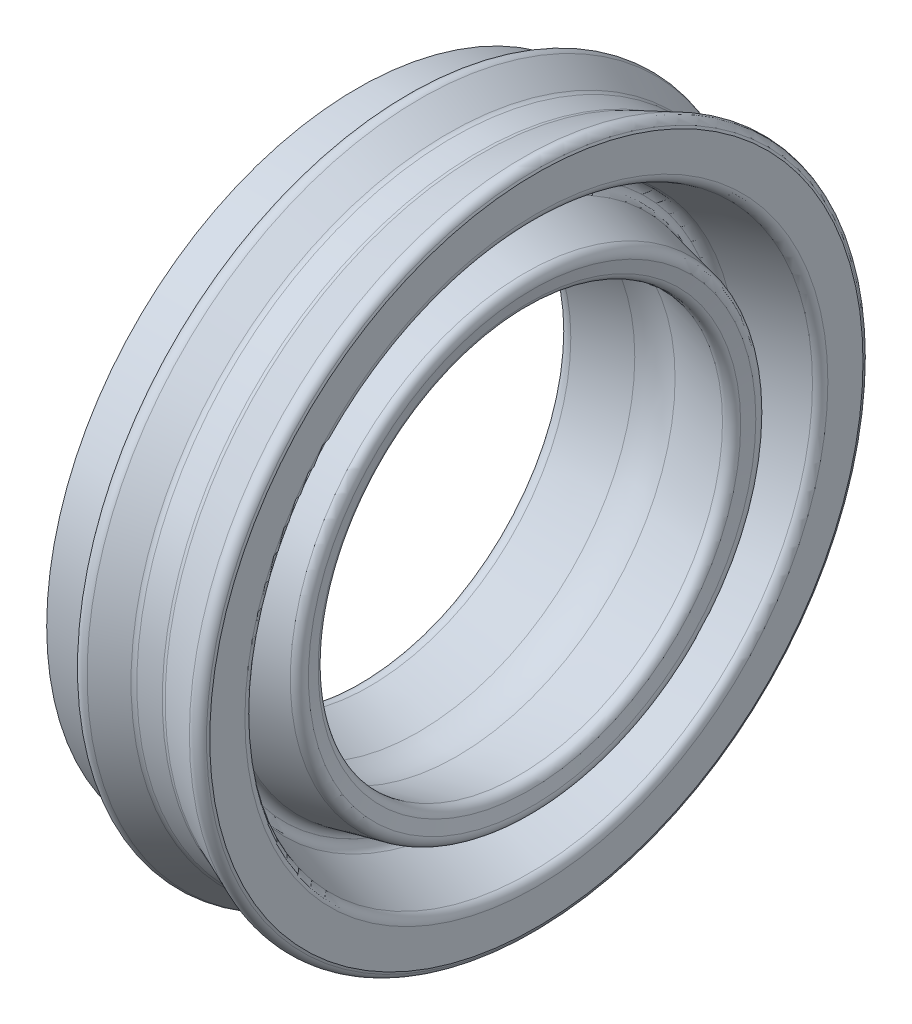
ISO-10303-21;
HEADER;
FILE_DESCRIPTION(('STEP AP214'),'2;1');
FILE_NAME('part.step','',(''),(''),'','','');
FILE_SCHEMA(('AUTOMOTIVE_DESIGN { 1 0 10303 214 1 1 1 1 }'));
ENDSEC;
DATA;
#1=APPLICATION_CONTEXT('core data for automotive mechanical design processes');
#2=APPLICATION_PROTOCOL_DEFINITION('international standard','automotive_design',2000,#1);
#3=PRODUCT_CONTEXT('',#1,'mechanical');
#4=PRODUCT('Part','Part','',(#3));
#5=PRODUCT_RELATED_PRODUCT_CATEGORY('part','',(#4));
#6=PRODUCT_DEFINITION_FORMATION('','',#4);
#7=PRODUCT_DEFINITION_CONTEXT('part definition',#1,'design');
#8=PRODUCT_DEFINITION('design','',#6,#7);
#9=PRODUCT_DEFINITION_SHAPE('','',#8);
#10=(LENGTH_UNIT() NAMED_UNIT(*) SI_UNIT(.MILLI.,.METRE.));
#11=(NAMED_UNIT(*) PLANE_ANGLE_UNIT() SI_UNIT($,.RADIAN.));
#12=(NAMED_UNIT(*) SI_UNIT($,.STERADIAN.) SOLID_ANGLE_UNIT());
#13=UNCERTAINTY_MEASURE_WITH_UNIT(LENGTH_MEASURE(1.E-05),#10,'distance_accuracy_value','');
#14=(GEOMETRIC_REPRESENTATION_CONTEXT(3) GLOBAL_UNCERTAINTY_ASSIGNED_CONTEXT((#13)) GLOBAL_UNIT_ASSIGNED_CONTEXT((#10,
#11,#12)) REPRESENTATION_CONTEXT('',''));
#15=CARTESIAN_POINT('',(0.,0.,0.));
#16=DIRECTION('',(0.,0.,1.));
#17=DIRECTION('',(1.,0.,0.));
#18=AXIS2_PLACEMENT_3D('',#15,#16,#17);
#19=CARTESIAN_POINT('',(-2.15254345756287,0.,-7.06499819716089));
#20=DIRECTION('',(-1.,0.,0.));
#21=DIRECTION('',(0.,0.,1.));
#22=AXIS2_PLACEMENT_3D('',#19,#20,#21);
#23=PLANE('',#22);
#24=CARTESIAN_POINT('',(-2.15254345756287,0.,0.));
#25=DIRECTION('',(1.,0.,0.));
#26=DIRECTION('',(0.,0.,-1.));
#27=AXIS2_PLACEMENT_3D('',#24,#25,#26);
#28=CIRCLE('',#27,7.06499819716089);
#29=CARTESIAN_POINT('',(-2.15254345756287,0.,-7.06499819716089));
#30=VERTEX_POINT('',#29);
#31=EDGE_CURVE('E10',#30,#30,#28,.T.);
#32=ORIENTED_EDGE('',*,*,#31,.T.);
#33=EDGE_LOOP('',(#32));
#34=FACE_BOUND('',#33,.T.);
#35=CARTESIAN_POINT('',(-2.15254345756287,0.,0.));
#36=DIRECTION('',(1.,0.,0.));
#37=DIRECTION('',(0.,0.,-1.));
#38=AXIS2_PLACEMENT_3D('',#35,#36,#37);
#39=CIRCLE('',#38,8.36700105742078);
#40=CARTESIAN_POINT('',(-2.15254345756287,0.,-8.36700105742078));
#41=VERTEX_POINT('',#40);
#42=EDGE_CURVE('E131',#41,#41,#39,.T.);
#43=ORIENTED_EDGE('',*,*,#42,.F.);
#44=EDGE_LOOP('',(#43));
#45=FACE_BOUND('',#44,.T.);
#46=ADVANCED_FACE('F34',(#34,#45),#23,.T.);
#47=CARTESIAN_POINT('',(0.,0.,0.));
#48=DIRECTION('',(1.,0.,0.));
#49=DIRECTION('',(0.,0.,-1.));
#50=AXIS2_PLACEMENT_3D('',#47,#48,#49);
#51=CYLINDRICAL_SURFACE('',#50,7.06499819716089);
#52=CARTESIAN_POINT('',(-0.840605768028675,0.,0.));
#53=DIRECTION('',(1.,0.,0.));
#54=DIRECTION('',(0.,0.,-1.));
#55=AXIS2_PLACEMENT_3D('',#52,#53,#54);
#56=CIRCLE('',#55,7.06499819716089);
#57=CARTESIAN_POINT('',(-0.840605768028675,0.,-7.06499819716089));
#58=VERTEX_POINT('',#57);
#59=EDGE_CURVE('E40',#58,#58,#56,.T.);
#60=ORIENTED_EDGE('',*,*,#59,.T.);
#61=EDGE_LOOP('',(#60));
#62=FACE_BOUND('',#61,.T.);
#63=ORIENTED_EDGE('',*,*,#31,.F.);
#64=EDGE_LOOP('',(#63));
#65=FACE_BOUND('',#64,.T.);
#66=ADVANCED_FACE('F139',(#62,#65),#51,.F.);
#67=CARTESIAN_POINT('',(-0.840605768028673,0.,0.));
#68=DIRECTION('',(1.,0.,0.));
#69=DIRECTION('',(0.,0.,-1.));
#70=AXIS2_PLACEMENT_3D('',#67,#68,#69);
#71=TOROIDAL_SURFACE('',#70,6.81499819716089,0.25);
#72=CARTESIAN_POINT('',(-0.590605768028673,0.,0.));
#73=DIRECTION('',(1.,0.,0.));
#74=DIRECTION('',(0.,0.,-1.));
#75=AXIS2_PLACEMENT_3D('',#72,#73,#74);
#76=CIRCLE('',#75,6.81499819716089);
#77=CARTESIAN_POINT('',(-0.590605768028673,0.,-6.81499819716089));
#78=VERTEX_POINT('',#77);
#79=EDGE_CURVE('E44',#78,#78,#76,.T.);
#80=ORIENTED_EDGE('',*,*,#79,.T.);
#81=EDGE_LOOP('',(#80));
#82=FACE_BOUND('',#81,.T.);
#83=ORIENTED_EDGE('',*,*,#59,.F.);
#84=EDGE_LOOP('',(#83));
#85=FACE_BOUND('',#84,.T.);
#86=ADVANCED_FACE('F143',(#82,#85),#71,.F.);
#87=CARTESIAN_POINT('',(-0.590605768028673,0.,-6.75936900395988));
#88=DIRECTION('',(-1.,0.,0.));
#89=DIRECTION('',(0.,0.,1.));
#90=AXIS2_PLACEMENT_3D('',#87,#88,#89);
#91=PLANE('',#90);
#92=CARTESIAN_POINT('',(-0.590605768028673,0.,0.));
#93=DIRECTION('',(1.,0.,0.));
#94=DIRECTION('',(0.,0.,-1.));
#95=AXIS2_PLACEMENT_3D('',#92,#93,#94);
#96=CIRCLE('',#95,6.75936900395988);
#97=CARTESIAN_POINT('',(-0.590605768028673,0.,-6.75936900395988));
#98=VERTEX_POINT('',#97);
#99=EDGE_CURVE('E48',#98,#98,#96,.T.);
#100=ORIENTED_EDGE('',*,*,#99,.T.);
#101=EDGE_LOOP('',(#100));
#102=FACE_BOUND('',#101,.T.);
#103=ORIENTED_EDGE('',*,*,#79,.F.);
#104=EDGE_LOOP('',(#103));
#105=FACE_BOUND('',#104,.T.);
#106=ADVANCED_FACE('F147',(#102,#105),#91,.T.);
#107=CARTESIAN_POINT('',(-0.590605768028673,0.,0.));
#108=DIRECTION('',(1.,0.,0.));
#109=DIRECTION('',(0.,0.,-1.));
#110=AXIS2_PLACEMENT_3D('',#107,#108,#109);
#111=CONICAL_SURFACE('',#110,6.75936900395988,0.304005539493656);
#112=CARTESIAN_POINT('',(-1.97737957350149,0.,0.));
#113=DIRECTION('',(1.,0.,0.));
#114=DIRECTION('',(0.,0.,-1.));
#115=AXIS2_PLACEMENT_3D('',#112,#113,#114);
#116=CIRCLE('',#115,6.32429570478301);
#117=CARTESIAN_POINT('',(-1.97737957350149,0.,-6.32429570478301));
#118=VERTEX_POINT('',#117);
#119=EDGE_CURVE('E53',#118,#118,#116,.T.);
#120=ORIENTED_EDGE('',*,*,#119,.T.);
#121=EDGE_LOOP('',(#120));
#122=FACE_BOUND('',#121,.T.);
#123=ORIENTED_EDGE('',*,*,#99,.F.);
#124=EDGE_LOOP('',(#123));
#125=FACE_BOUND('',#124,.T.);
#126=ADVANCED_FACE('F154',(#122,#125),#111,.T.);
#127=CARTESIAN_POINT('',(-1.90254345756287,0.,0.));
#128=DIRECTION('',(1.,0.,0.));
#129=DIRECTION('',(0.,0.,-1.));
#130=AXIS2_PLACEMENT_3D('',#127,#128,#129);
#131=TOROIDAL_SURFACE('',#130,6.08575942714117,0.25);
#132=CARTESIAN_POINT('',(-2.15254345756287,0.,0.));
#133=DIRECTION('',(1.,0.,0.));
#134=DIRECTION('',(0.,0.,-1.));
#135=AXIS2_PLACEMENT_3D('',#132,#133,#134);
#136=CIRCLE('',#135,6.08575942714117);
#137=CARTESIAN_POINT('',(-2.15254345756287,0.,-6.08575942714117));
#138=VERTEX_POINT('',#137);
#139=EDGE_CURVE('E56',#138,#138,#136,.T.);
#140=ORIENTED_EDGE('',*,*,#139,.T.);
#141=EDGE_LOOP('',(#140));
#142=FACE_BOUND('',#141,.T.);
#143=ORIENTED_EDGE('',*,*,#119,.F.);
#144=EDGE_LOOP('',(#143));
#145=FACE_BOUND('',#144,.T.);
#146=ADVANCED_FACE('F158',(#142,#145),#131,.T.);
#147=CARTESIAN_POINT('',(-2.15254345756287,0.,-5.66512866068794));
#148=DIRECTION('',(-1.,0.,0.));
#149=DIRECTION('',(0.,0.,1.));
#150=AXIS2_PLACEMENT_3D('',#147,#148,#149);
#151=PLANE('',#150);
#152=CARTESIAN_POINT('',(-2.15254345756287,0.,0.));
#153=DIRECTION('',(1.,0.,0.));
#154=DIRECTION('',(0.,0.,-1.));
#155=AXIS2_PLACEMENT_3D('',#152,#153,#154);
#156=CIRCLE('',#155,5.66512866068794);
#157=CARTESIAN_POINT('',(-2.15254345756287,0.,-5.66512866068794));
#158=VERTEX_POINT('',#157);
#159=EDGE_CURVE('E59',#158,#158,#156,.T.);
#160=ORIENTED_EDGE('',*,*,#159,.T.);
#161=EDGE_LOOP('',(#160));
#162=FACE_BOUND('',#161,.T.);
#163=ORIENTED_EDGE('',*,*,#139,.F.);
#164=EDGE_LOOP('',(#163));
#165=FACE_BOUND('',#164,.T.);
#166=ADVANCED_FACE('F162',(#162,#165),#151,.T.);
#167=CARTESIAN_POINT('',(-1.90254345756287,0.,0.));
#168=DIRECTION('',(1.,0.,0.));
#169=DIRECTION('',(0.,0.,-1.));
#170=AXIS2_PLACEMENT_3D('',#167,#168,#169);
#171=TOROIDAL_SURFACE('',#170,5.66512866068794,0.25);
#172=CARTESIAN_POINT('',(-1.82770734162425,0.,0.));
#173=DIRECTION('',(1.,0.,0.));
#174=DIRECTION('',(0.,0.,-1.));
#175=AXIS2_PLACEMENT_3D('',#172,#173,#174);
#176=CIRCLE('',#175,5.42659238304611);
#177=CARTESIAN_POINT('',(-1.82770734162425,0.,-5.42659238304611));
#178=VERTEX_POINT('',#177);
#179=EDGE_CURVE('E62',#178,#178,#176,.T.);
#180=ORIENTED_EDGE('',*,*,#179,.T.);
#181=EDGE_LOOP('',(#180));
#182=FACE_BOUND('',#181,.T.);
#183=ORIENTED_EDGE('',*,*,#159,.F.);
#184=EDGE_LOOP('',(#183));
#185=FACE_BOUND('',#184,.T.);
#186=ADVANCED_FACE('F166',(#182,#185),#171,.T.);
#187=CARTESIAN_POINT('',(-1.82770734162425,0.,0.));
#188=DIRECTION('',(1.,0.,0.));
#189=DIRECTION('',(0.,0.,-1.));
#190=AXIS2_PLACEMENT_3D('',#187,#188,#189);
#191=CONICAL_SURFACE('',#190,5.42659238304611,0.304005539493656);
#192=CARTESIAN_POINT('',(-0.516130793570983,0.,0.));
#193=DIRECTION('',(1.,0.,0.));
#194=DIRECTION('',(0.,0.,-1.));
#195=AXIS2_PLACEMENT_3D('',#192,#193,#194);
#196=CIRCLE('',#195,5.83807400581154);
#197=CARTESIAN_POINT('',(-0.516130793570983,0.,-5.83807400581154));
#198=VERTEX_POINT('',#197);
#199=EDGE_CURVE('E65',#198,#198,#196,.T.);
#200=ORIENTED_EDGE('',*,*,#199,.T.);
#201=EDGE_LOOP('',(#200));
#202=FACE_BOUND('',#201,.T.);
#203=ORIENTED_EDGE('',*,*,#179,.F.);
#204=EDGE_LOOP('',(#203));
#205=FACE_BOUND('',#204,.T.);
#206=ADVANCED_FACE('F170',(#202,#205),#191,.F.);
#207=CARTESIAN_POINT('',(0.0825581339379701,0.,0.));
#208=DIRECTION('',(1.,0.,0.));
#209=DIRECTION('',(0.,0.,-1.));
#210=AXIS2_PLACEMENT_3D('',#207,#208,#209);
#211=TOROIDAL_SURFACE('',#210,3.92978378467687,2.);
#212=CARTESIAN_POINT('',(0.527386143729835,0.,0.));
#213=DIRECTION('',(1.,0.,0.));
#214=DIRECTION('',(0.,0.,-1.));
#215=AXIS2_PLACEMENT_3D('',#212,#213,#214);
#216=CIRCLE('',#215,5.87968840842251);
#217=CARTESIAN_POINT('',(0.527386143729835,0.,-5.87968840842251));
#218=VERTEX_POINT('',#217);
#219=EDGE_CURVE('E68',#218,#218,#216,.T.);
#220=ORIENTED_EDGE('',*,*,#219,.T.);
#221=EDGE_LOOP('',(#220));
#222=FACE_BOUND('',#221,.T.);
#223=ORIENTED_EDGE('',*,*,#199,.F.);
#224=EDGE_LOOP('',(#223));
#225=FACE_BOUND('',#224,.T.);
#226=ADVANCED_FACE('F174',(#222,#225),#211,.F.);
#227=CARTESIAN_POINT('',(0.527386143729835,0.,0.));
#228=DIRECTION('',(-1.,0.,0.));
#229=DIRECTION('',(0.,0.,1.));
#230=AXIS2_PLACEMENT_3D('',#227,#228,#229);
#231=CONICAL_SURFACE('',#230,5.87968840842251,0.224289797688572);
#232=CARTESIAN_POINT('',(2.18313202288083,0.,0.));
#233=DIRECTION('',(1.,0.,0.));
#234=DIRECTION('',(0.,0.,-1.));
#235=AXIS2_PLACEMENT_3D('',#232,#233,#234);
#236=CIRCLE('',#235,5.5019662700294);
#237=CARTESIAN_POINT('',(2.18313202288083,0.,-5.5019662700294));
#238=VERTEX_POINT('',#237);
#239=EDGE_CURVE('E71',#238,#238,#236,.T.);
#240=ORIENTED_EDGE('',*,*,#239,.T.);
#241=EDGE_LOOP('',(#240));
#242=FACE_BOUND('',#241,.T.);
#243=ORIENTED_EDGE('',*,*,#219,.F.);
#244=EDGE_LOOP('',(#243));
#245=FACE_BOUND('',#244,.T.);
#246=ADVANCED_FACE('F178',(#242,#245),#231,.F.);
#247=CARTESIAN_POINT('',(2.23873552410482,0.,0.));
#248=DIRECTION('',(1.,0.,0.));
#249=DIRECTION('',(0.,0.,-1.));
#250=AXIS2_PLACEMENT_3D('',#247,#248,#249);
#251=TOROIDAL_SURFACE('',#250,5.74570434799761,0.25);
#252=CARTESIAN_POINT('',(2.48288014132354,0.,0.));
#253=DIRECTION('',(1.,0.,0.));
#254=DIRECTION('',(0.,0.,-1.));
#255=AXIS2_PLACEMENT_3D('',#252,#253,#254);
#256=CIRCLE('',#255,5.69191395960784);
#257=CARTESIAN_POINT('',(2.48288014132354,0.,-5.69191395960784));
#258=VERTEX_POINT('',#257);
#259=EDGE_CURVE('E74',#258,#258,#256,.T.);
#260=ORIENTED_EDGE('',*,*,#259,.T.);
#261=EDGE_LOOP('',(#260));
#262=FACE_BOUND('',#261,.T.);
#263=ORIENTED_EDGE('',*,*,#239,.F.);
#264=EDGE_LOOP('',(#263));
#265=FACE_BOUND('',#264,.T.);
#266=ADVANCED_FACE('F182',(#262,#265),#251,.T.);
#267=CARTESIAN_POINT('',(2.48288014132354,0.,0.));
#268=DIRECTION('',(1.,0.,0.));
#269=DIRECTION('',(0.,0.,-1.));
#270=AXIS2_PLACEMENT_3D('',#267,#268,#269);
#271=CONICAL_SURFACE('',#270,5.69191395960784,1.35393907182743);
#272=CARTESIAN_POINT('',(2.55630963196458,0.,0.));
#273=DIRECTION('',(1.,0.,0.));
#274=DIRECTION('',(0.,0.,-1.));
#275=AXIS2_PLACEMENT_3D('',#272,#273,#274);
#276=CIRCLE('',#275,6.02519682708253);
#277=CARTESIAN_POINT('',(2.55630963196458,0.,-6.02519682708253));
#278=VERTEX_POINT('',#277);
#279=EDGE_CURVE('E77',#278,#278,#276,.T.);
#280=ORIENTED_EDGE('',*,*,#279,.T.);
#281=EDGE_LOOP('',(#280));
#282=FACE_BOUND('',#281,.T.);
#283=ORIENTED_EDGE('',*,*,#259,.F.);
#284=EDGE_LOOP('',(#283));
#285=FACE_BOUND('',#284,.T.);
#286=ADVANCED_FACE('F186',(#282,#285),#271,.F.);
#287=CARTESIAN_POINT('',(2.31216501474585,0.,0.));
#288=DIRECTION('',(1.,0.,0.));
#289=DIRECTION('',(0.,0.,-1.));
#290=AXIS2_PLACEMENT_3D('',#287,#288,#289);
#291=TOROIDAL_SURFACE('',#290,6.0789872154723,0.25);
#292=CARTESIAN_POINT('',(2.36595540313562,0.,0.));
#293=DIRECTION('',(1.,0.,0.));
#294=DIRECTION('',(0.,0.,-1.));
#295=AXIS2_PLACEMENT_3D('',#292,#293,#294);
#296=CIRCLE('',#295,6.32313183269103);
#297=CARTESIAN_POINT('',(2.36595540313562,0.,-6.32313183269103));
#298=VERTEX_POINT('',#297);
#299=EDGE_CURVE('E80',#298,#298,#296,.T.);
#300=ORIENTED_EDGE('',*,*,#299,.T.);
#301=EDGE_LOOP('',(#300));
#302=FACE_BOUND('',#301,.T.);
#303=ORIENTED_EDGE('',*,*,#279,.F.);
#304=EDGE_LOOP('',(#303));
#305=FACE_BOUND('',#304,.T.);
#306=ADVANCED_FACE('F190',(#302,#305),#291,.T.);
#307=CARTESIAN_POINT('',(2.36595540313562,0.,0.));
#308=DIRECTION('',(-1.,0.,0.));
#309=DIRECTION('',(0.,0.,1.));
#310=AXIS2_PLACEMENT_3D('',#307,#308,#309);
#311=CONICAL_SURFACE('',#310,6.32313183269103,0.216857254967467);
#312=CARTESIAN_POINT('',(0.945948672242765,0.,0.));
#313=DIRECTION('',(1.,0.,0.));
#314=DIRECTION('',(0.,0.,-1.));
#315=AXIS2_PLACEMENT_3D('',#312,#313,#314);
#316=CIRCLE('',#315,6.63599031157524);
#317=CARTESIAN_POINT('',(0.945948672242765,0.,-6.63599031157524));
#318=VERTEX_POINT('',#317);
#319=EDGE_CURVE('E83',#318,#318,#316,.T.);
#320=ORIENTED_EDGE('',*,*,#319,.T.);
#321=EDGE_LOOP('',(#320));
#322=FACE_BOUND('',#321,.T.);
#323=ORIENTED_EDGE('',*,*,#299,.F.);
#324=EDGE_LOOP('',(#323));
#325=FACE_BOUND('',#324,.T.);
#326=ADVANCED_FACE('F194',(#322,#325),#311,.T.);
#327=CARTESIAN_POINT('',(0.999739060632539,0.,0.));
#328=DIRECTION('',(1.,0.,0.));
#329=DIRECTION('',(0.,0.,-1.));
#330=AXIS2_PLACEMENT_3D('',#327,#328,#329);
#331=TOROIDAL_SURFACE('',#330,6.88013492879397,0.250000000000002);
#332=CARTESIAN_POINT('',(0.749739060632538,0.,0.));
#333=DIRECTION('',(1.,0.,0.));
#334=DIRECTION('',(0.,0.,-1.));
#335=AXIS2_PLACEMENT_3D('',#332,#333,#334);
#336=CIRCLE('',#335,6.88013492879397);
#337=CARTESIAN_POINT('',(0.749739060632538,0.,-6.88013492879397));
#338=VERTEX_POINT('',#337);
#339=EDGE_CURVE('E86',#338,#338,#336,.T.);
#340=ORIENTED_EDGE('',*,*,#339,.T.);
#341=EDGE_LOOP('',(#340));
#342=FACE_BOUND('',#341,.T.);
#343=ORIENTED_EDGE('',*,*,#319,.F.);
#344=EDGE_LOOP('',(#343));
#345=FACE_BOUND('',#344,.T.);
#346=ADVANCED_FACE('F198',(#342,#345),#331,.F.);
#347=CARTESIAN_POINT('',(0.749739060632539,0.,-6.88141618000081));
#348=DIRECTION('',(1.,0.,0.));
#349=DIRECTION('',(0.,0.,-1.));
#350=AXIS2_PLACEMENT_3D('',#347,#348,#349);
#351=PLANE('',#350);
#352=CARTESIAN_POINT('',(0.749739060632539,0.,0.));
#353=DIRECTION('',(1.,0.,0.));
#354=DIRECTION('',(0.,0.,-1.));
#355=AXIS2_PLACEMENT_3D('',#352,#353,#354);
#356=CIRCLE('',#355,6.88141618000081);
#357=CARTESIAN_POINT('',(0.749739060632539,0.,-6.88141618000081));
#358=VERTEX_POINT('',#357);
#359=EDGE_CURVE('E89',#358,#358,#356,.T.);
#360=ORIENTED_EDGE('',*,*,#359,.T.);
#361=EDGE_LOOP('',(#360));
#362=FACE_BOUND('',#361,.T.);
#363=ORIENTED_EDGE('',*,*,#339,.F.);
#364=EDGE_LOOP('',(#363));
#365=FACE_BOUND('',#364,.T.);
#366=ADVANCED_FACE('F202',(#362,#365),#351,.T.);
#367=CARTESIAN_POINT('',(0.999739060632539,0.,0.));
#368=DIRECTION('',(1.,0.,0.));
#369=DIRECTION('',(0.,0.,-1.));
#370=AXIS2_PLACEMENT_3D('',#367,#368,#369);
#371=TOROIDAL_SURFACE('',#370,6.88141618000081,0.25);
#372=CARTESIAN_POINT('',(0.924902944693923,0.,0.));
#373=DIRECTION('',(1.,0.,0.));
#374=DIRECTION('',(0.,0.,-1.));
#375=AXIS2_PLACEMENT_3D('',#372,#373,#374);
#376=CIRCLE('',#375,7.11995245764264);
#377=CARTESIAN_POINT('',(0.924902944693923,0.,-7.11995245764264));
#378=VERTEX_POINT('',#377);
#379=EDGE_CURVE('E92',#378,#378,#376,.T.);
#380=ORIENTED_EDGE('',*,*,#379,.T.);
#381=EDGE_LOOP('',(#380));
#382=FACE_BOUND('',#381,.T.);
#383=ORIENTED_EDGE('',*,*,#359,.F.);
#384=EDGE_LOOP('',(#383));
#385=FACE_BOUND('',#384,.T.);
#386=ADVANCED_FACE('F206',(#382,#385),#371,.F.);
#387=CARTESIAN_POINT('',(0.924902944693923,0.,0.));
#388=DIRECTION('',(1.,0.,0.));
#389=DIRECTION('',(0.,0.,-1.));
#390=AXIS2_PLACEMENT_3D('',#387,#388,#389);
#391=CONICAL_SURFACE('',#390,7.11995245764264,0.304005539493656);
#392=CARTESIAN_POINT('',(2.49590261882728,0.,0.));
#393=DIRECTION('',(1.,0.,0.));
#394=DIRECTION('',(0.,0.,-1.));
#395=AXIS2_PLACEMENT_3D('',#392,#393,#394);
#396=CIRCLE('',#395,7.61282303865131);
#397=CARTESIAN_POINT('',(2.49590261882728,0.,-7.61282303865131));
#398=VERTEX_POINT('',#397);
#399=EDGE_CURVE('E95',#398,#398,#396,.T.);
#400=ORIENTED_EDGE('',*,*,#399,.T.);
#401=EDGE_LOOP('',(#400));
#402=FACE_BOUND('',#401,.T.);
#403=ORIENTED_EDGE('',*,*,#379,.F.);
#404=EDGE_LOOP('',(#403));
#405=FACE_BOUND('',#404,.T.);
#406=ADVANCED_FACE('F210',(#402,#405),#391,.F.);
#407=CARTESIAN_POINT('',(2.42106650288866,0.,0.));
#408=DIRECTION('',(1.,0.,0.));
#409=DIRECTION('',(0.,0.,-1.));
#410=AXIS2_PLACEMENT_3D('',#407,#408,#409);
#411=TOROIDAL_SURFACE('',#410,7.85135931629314,0.25);
#412=CARTESIAN_POINT('',(2.67106650288866,0.,0.));
#413=DIRECTION('',(1.,0.,0.));
#414=DIRECTION('',(0.,0.,-1.));
#415=AXIS2_PLACEMENT_3D('',#412,#413,#414);
#416=CIRCLE('',#415,7.85135931629314);
#417=CARTESIAN_POINT('',(2.67106650288866,0.,-7.85135931629314));
#418=VERTEX_POINT('',#417);
#419=EDGE_CURVE('E98',#418,#418,#416,.T.);
#420=ORIENTED_EDGE('',*,*,#419,.T.);
#421=EDGE_LOOP('',(#420));
#422=FACE_BOUND('',#421,.T.);
#423=ORIENTED_EDGE('',*,*,#399,.F.);
#424=EDGE_LOOP('',(#423));
#425=FACE_BOUND('',#424,.T.);
#426=ADVANCED_FACE('F214',(#422,#425),#411,.T.);
#427=CARTESIAN_POINT('',(2.67106650288866,0.,-8.79834552430218));
#428=DIRECTION('',(1.,0.,0.));
#429=DIRECTION('',(0.,0.,-1.));
#430=AXIS2_PLACEMENT_3D('',#427,#428,#429);
#431=PLANE('',#430);
#432=CARTESIAN_POINT('',(2.67106650288866,0.,0.));
#433=DIRECTION('',(1.,0.,0.));
#434=DIRECTION('',(0.,0.,-1.));
#435=AXIS2_PLACEMENT_3D('',#432,#433,#434);
#436=CIRCLE('',#435,8.79834552430218);
#437=CARTESIAN_POINT('',(2.67106650288866,0.,-8.79834552430218));
#438=VERTEX_POINT('',#437);
#439=EDGE_CURVE('E101',#438,#438,#436,.T.);
#440=ORIENTED_EDGE('',*,*,#439,.T.);
#441=EDGE_LOOP('',(#440));
#442=FACE_BOUND('',#441,.T.);
#443=ORIENTED_EDGE('',*,*,#419,.F.);
#444=EDGE_LOOP('',(#443));
#445=FACE_BOUND('',#444,.T.);
#446=ADVANCED_FACE('F218',(#442,#445),#431,.T.);
#447=CARTESIAN_POINT('',(2.67106650288866,0.,0.));
#448=DIRECTION('',(-1.,0.,0.));
#449=DIRECTION('',(0.,0.,1.));
#450=AXIS2_PLACEMENT_3D('',#447,#448,#449);
#451=CONICAL_SURFACE('',#450,8.79834552430218,1.17521676341608);
#452=CARTESIAN_POINT('',(2.64546930260965,0.,0.));
#453=DIRECTION('',(1.,0.,0.));
#454=DIRECTION('',(0.,0.,-1.));
#455=AXIS2_PLACEMENT_3D('',#452,#453,#454);
#456=CIRCLE('',#455,8.85964263263059);
#457=CARTESIAN_POINT('',(2.64546930260965,0.,-8.85964263263059));
#458=VERTEX_POINT('',#457);
#459=EDGE_CURVE('E104',#458,#458,#456,.T.);
#460=ORIENTED_EDGE('',*,*,#459,.T.);
#461=EDGE_LOOP('',(#460));
#462=FACE_BOUND('',#461,.T.);
#463=ORIENTED_EDGE('',*,*,#439,.F.);
#464=EDGE_LOOP('',(#463));
#465=FACE_BOUND('',#464,.T.);
#466=ADVANCED_FACE('F222',(#462,#465),#451,.T.);
#467=CARTESIAN_POINT('',(2.41477595545286,0.,0.));
#468=DIRECTION('',(1.,0.,0.));
#469=DIRECTION('',(0.,0.,-1.));
#470=AXIS2_PLACEMENT_3D('',#467,#468,#469);
#471=TOROIDAL_SURFACE('',#470,8.76330686784098,0.249999999999999);
#472=CARTESIAN_POINT('',(2.31844019066325,0.,0.));
#473=DIRECTION('',(1.,0.,0.));
#474=DIRECTION('',(0.,0.,-1.));
#475=AXIS2_PLACEMENT_3D('',#472,#473,#474);
#476=CIRCLE('',#475,8.99400021499777);
#477=CARTESIAN_POINT('',(2.31844019066325,0.,-8.99400021499777));
#478=VERTEX_POINT('',#477);
#479=EDGE_CURVE('E107',#478,#478,#476,.T.);
#480=ORIENTED_EDGE('',*,*,#479,.T.);
#481=EDGE_LOOP('',(#480));
#482=FACE_BOUND('',#481,.T.);
#483=ORIENTED_EDGE('',*,*,#459,.F.);
#484=EDGE_LOOP('',(#483));
#485=FACE_BOUND('',#484,.T.);
#486=ADVANCED_FACE('F226',(#482,#485),#471,.T.);
#487=CARTESIAN_POINT('',(2.31844019066325,0.,0.));
#488=DIRECTION('',(1.,0.,0.));
#489=DIRECTION('',(0.,0.,-1.));
#490=AXIS2_PLACEMENT_3D('',#487,#488,#489);
#491=CONICAL_SURFACE('',#490,8.99400021499777,0.395579563378804);
#492=CARTESIAN_POINT('',(1.19691928026863,0.,0.));
#493=DIRECTION('',(1.,0.,0.));
#494=DIRECTION('',(0.,0.,-1.));
#495=AXIS2_PLACEMENT_3D('',#492,#493,#494);
#496=CIRCLE('',#495,8.52566172166021);
#497=CARTESIAN_POINT('',(1.19691928026863,0.,-8.52566172166021));
#498=VERTEX_POINT('',#497);
#499=EDGE_CURVE('E110',#498,#498,#496,.T.);
#500=ORIENTED_EDGE('',*,*,#499,.T.);
#501=EDGE_LOOP('',(#500));
#502=FACE_BOUND('',#501,.T.);
#503=ORIENTED_EDGE('',*,*,#479,.F.);
#504=EDGE_LOOP('',(#503));
#505=FACE_BOUND('',#504,.T.);
#506=ADVANCED_FACE('F230',(#502,#505),#491,.T.);
#507=CARTESIAN_POINT('',(1.10058351547902,0.,0.));
#508=DIRECTION('',(1.,0.,0.));
#509=DIRECTION('',(0.,0.,-1.));
#510=AXIS2_PLACEMENT_3D('',#507,#508,#509);
#511=TOROIDAL_SURFACE('',#510,8.756355068817,0.250000000000002);
#512=CARTESIAN_POINT('',(1.10058351547902,0.,0.));
#513=DIRECTION('',(1.,0.,0.));
#514=DIRECTION('',(0.,0.,-1.));
#515=AXIS2_PLACEMENT_3D('',#512,#513,#514);
#516=CIRCLE('',#515,8.506355068817);
#517=CARTESIAN_POINT('',(1.10058351547902,0.,-8.506355068817));
#518=VERTEX_POINT('',#517);
#519=EDGE_CURVE('E113',#518,#518,#516,.T.);
#520=ORIENTED_EDGE('',*,*,#519,.T.);
#521=EDGE_LOOP('',(#520));
#522=FACE_BOUND('',#521,.T.);
#523=ORIENTED_EDGE('',*,*,#499,.F.);
#524=EDGE_LOOP('',(#523));
#525=FACE_BOUND('',#524,.T.);
#526=ADVANCED_FACE('F234',(#522,#525),#511,.F.);
#527=CARTESIAN_POINT('',(0.,0.,0.));
#528=DIRECTION('',(1.,0.,0.));
#529=DIRECTION('',(0.,0.,-1.));
#530=AXIS2_PLACEMENT_3D('',#527,#528,#529);
#531=CYLINDRICAL_SURFACE('',#530,8.506355068817);
#532=CARTESIAN_POINT('',(0.41470208971361,0.,0.));
#533=DIRECTION('',(1.,0.,0.));
#534=DIRECTION('',(0.,0.,-1.));
#535=AXIS2_PLACEMENT_3D('',#532,#533,#534);
#536=CIRCLE('',#535,8.506355068817);
#537=CARTESIAN_POINT('',(0.41470208971361,0.,-8.506355068817));
#538=VERTEX_POINT('',#537);
#539=EDGE_CURVE('E116',#538,#538,#536,.T.);
#540=ORIENTED_EDGE('',*,*,#539,.T.);
#541=EDGE_LOOP('',(#540));
#542=FACE_BOUND('',#541,.T.);
#543=ORIENTED_EDGE('',*,*,#519,.F.);
#544=EDGE_LOOP('',(#543));
#545=FACE_BOUND('',#544,.T.);
#546=ADVANCED_FACE('F238',(#542,#545),#531,.T.);
#547=CARTESIAN_POINT('',(0.414702089713609,0.,0.));
#548=DIRECTION('',(1.,0.,0.));
#549=DIRECTION('',(0.,0.,-1.));
#550=AXIS2_PLACEMENT_3D('',#547,#548,#549);
#551=TOROIDAL_SURFACE('',#550,8.756355068817,0.25);
#552=CARTESIAN_POINT('',(0.291448946718389,0.,0.));
#553=DIRECTION('',(1.,0.,0.));
#554=DIRECTION('',(0.,0.,-1.));
#555=AXIS2_PLACEMENT_3D('',#552,#553,#554);
#556=CIRCLE('',#555,8.53884952235485);
#557=CARTESIAN_POINT('',(0.291448946718389,0.,-8.53884952235485));
#558=VERTEX_POINT('',#557);
#559=EDGE_CURVE('E119',#558,#558,#556,.T.);
#560=ORIENTED_EDGE('',*,*,#559,.T.);
#561=EDGE_LOOP('',(#560));
#562=FACE_BOUND('',#561,.T.);
#563=ORIENTED_EDGE('',*,*,#539,.F.);
#564=EDGE_LOOP('',(#563));
#565=FACE_BOUND('',#564,.T.);
#566=ADVANCED_FACE('F242',(#562,#565),#551,.F.);
#567=CARTESIAN_POINT('',(0.291448946718389,0.,0.));
#568=DIRECTION('',(-1.,0.,0.));
#569=DIRECTION('',(0.,0.,1.));
#570=AXIS2_PLACEMENT_3D('',#567,#568,#569);
#571=CONICAL_SURFACE('',#570,8.53884952235485,0.515549007458979);
#572=CARTESIAN_POINT('',(-0.464256902288629,0.,0.));
#573=DIRECTION('',(1.,0.,0.));
#574=DIRECTION('',(0.,0.,-1.));
#575=AXIS2_PLACEMENT_3D('',#572,#573,#574);
#576=CIRCLE('',#575,8.96708283679216);
#577=CARTESIAN_POINT('',(-0.464256902288629,0.,-8.96708283679216));
#578=VERTEX_POINT('',#577);
#579=EDGE_CURVE('E122',#578,#578,#576,.T.);
#580=ORIENTED_EDGE('',*,*,#579,.T.);
#581=EDGE_LOOP('',(#580));
#582=FACE_BOUND('',#581,.T.);
#583=ORIENTED_EDGE('',*,*,#559,.F.);
#584=EDGE_LOOP('',(#583));
#585=FACE_BOUND('',#584,.T.);
#586=ADVANCED_FACE('F246',(#582,#585),#571,.T.);
#587=CARTESIAN_POINT('',(-0.587510045283851,0.,0.));
#588=DIRECTION('',(1.,0.,0.));
#589=DIRECTION('',(0.,0.,-1.));
#590=AXIS2_PLACEMENT_3D('',#587,#588,#589);
#591=TOROIDAL_SURFACE('',#590,8.74957729033,0.25);
#592=CARTESIAN_POINT('',(-0.805015591746005,0.,0.));
#593=DIRECTION('',(1.,0.,0.));
#594=DIRECTION('',(0.,0.,-1.));
#595=AXIS2_PLACEMENT_3D('',#592,#593,#594);
#596=CIRCLE('',#595,8.87283043332522);
#597=CARTESIAN_POINT('',(-0.805015591746005,0.,-8.87283043332522));
#598=VERTEX_POINT('',#597);
#599=EDGE_CURVE('E125',#598,#598,#596,.T.);
#600=ORIENTED_EDGE('',*,*,#599,.T.);
#601=EDGE_LOOP('',(#600));
#602=FACE_BOUND('',#601,.T.);
#603=ORIENTED_EDGE('',*,*,#579,.F.);
#604=EDGE_LOOP('',(#603));
#605=FACE_BOUND('',#604,.T.);
#606=ADVANCED_FACE('F250',(#602,#605),#591,.T.);
#607=CARTESIAN_POINT('',(-0.805015591746005,0.,0.));
#608=DIRECTION('',(1.,0.,0.));
#609=DIRECTION('',(0.,0.,-1.));
#610=AXIS2_PLACEMENT_3D('',#607,#608,#609);
#611=CONICAL_SURFACE('',#610,8.87283043332522,1.05524731933592);
#612=CARTESIAN_POINT('',(-1.09165223809186,0.,0.));
#613=DIRECTION('',(1.,0.,0.));
#614=DIRECTION('',(0.,0.,-1.));
#615=AXIS2_PLACEMENT_3D('',#612,#613,#614);
#616=CIRCLE('',#615,8.36700105742077);
#617=CARTESIAN_POINT('',(-1.09165223809186,0.,-8.36700105742077));
#618=VERTEX_POINT('',#617);
#619=EDGE_CURVE('E128',#618,#618,#616,.T.);
#620=ORIENTED_EDGE('',*,*,#619,.T.);
#621=EDGE_LOOP('',(#620));
#622=FACE_BOUND('',#621,.T.);
#623=ORIENTED_EDGE('',*,*,#599,.F.);
#624=EDGE_LOOP('',(#623));
#625=FACE_BOUND('',#624,.T.);
#626=ADVANCED_FACE('F254',(#622,#625),#611,.T.);
#627=CARTESIAN_POINT('',(0.,0.,0.));
#628=DIRECTION('',(1.,0.,0.));
#629=DIRECTION('',(0.,0.,-1.));
#630=AXIS2_PLACEMENT_3D('',#627,#628,#629);
#631=CYLINDRICAL_SURFACE('',#630,8.36700105742078);
#632=ORIENTED_EDGE('',*,*,#42,.T.);
#633=EDGE_LOOP('',(#632));
#634=FACE_BOUND('',#633,.T.);
#635=ORIENTED_EDGE('',*,*,#619,.F.);
#636=EDGE_LOOP('',(#635));
#637=FACE_BOUND('',#636,.T.);
#638=ADVANCED_FACE('F135',(#634,#637),#631,.T.);
#639=CLOSED_SHELL('',(#46,#66,#86,#106,#126,#146,#166,#186,#206,#226,#246,#266,#286,#306,#326,
#346,#366,#386,#406,#426,#446,#466,#486,#506,#526,#546,#566,#586,#606,#626,#638));
#640=MANIFOLD_SOLID_BREP('B2',#639);
#641=ADVANCED_BREP_SHAPE_REPRESENTATION('',(#18,#640),#14);
#642=SHAPE_DEFINITION_REPRESENTATION(#9,#641);
ENDSEC;
END-ISO-10303-21;
